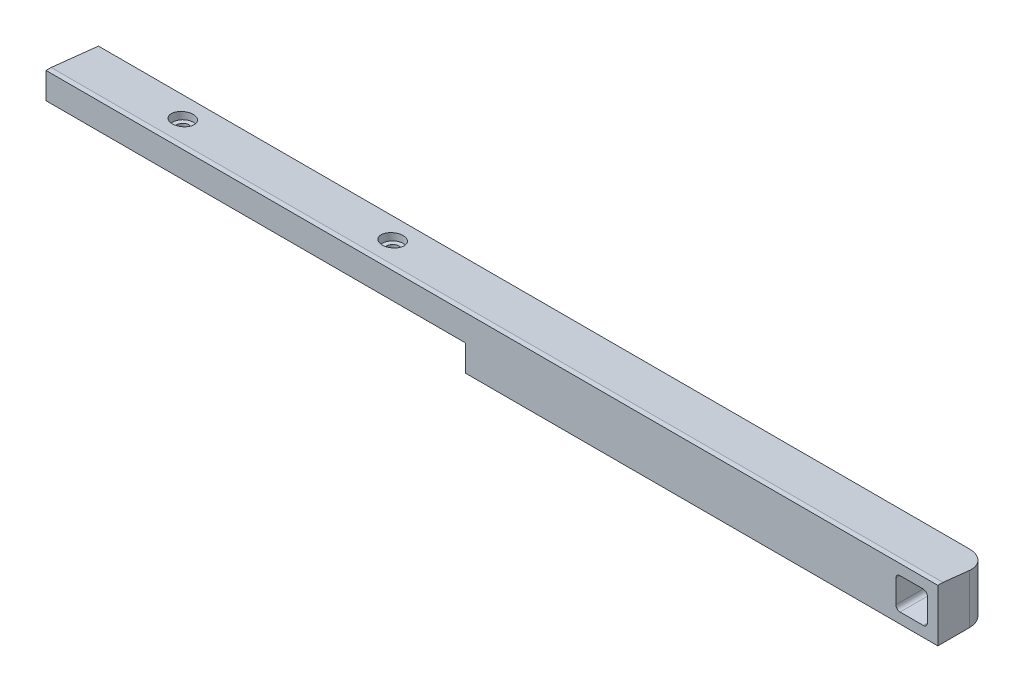
ISO-10303-21;
HEADER;
FILE_DESCRIPTION(('STEP AP214'),'2;1');
FILE_NAME('part.step','',(''),(''),'','','');
FILE_SCHEMA(('AUTOMOTIVE_DESIGN { 1 0 10303 214 1 1 1 1 }'));
ENDSEC;
DATA;
#1=APPLICATION_CONTEXT('core data for automotive mechanical design processes');
#2=APPLICATION_PROTOCOL_DEFINITION('international standard','automotive_design',2000,#1);
#3=PRODUCT_CONTEXT('',#1,'mechanical');
#4=PRODUCT('Part','Part','',(#3));
#5=PRODUCT_RELATED_PRODUCT_CATEGORY('part','',(#4));
#6=PRODUCT_DEFINITION_FORMATION('','',#4);
#7=PRODUCT_DEFINITION_CONTEXT('part definition',#1,'design');
#8=PRODUCT_DEFINITION('design','',#6,#7);
#9=PRODUCT_DEFINITION_SHAPE('','',#8);
#10=(LENGTH_UNIT() NAMED_UNIT(*) SI_UNIT(.MILLI.,.METRE.));
#11=(NAMED_UNIT(*) PLANE_ANGLE_UNIT() SI_UNIT($,.RADIAN.));
#12=(NAMED_UNIT(*) SI_UNIT($,.STERADIAN.) SOLID_ANGLE_UNIT());
#13=UNCERTAINTY_MEASURE_WITH_UNIT(LENGTH_MEASURE(1.E-05),#10,'distance_accuracy_value','');
#14=(GEOMETRIC_REPRESENTATION_CONTEXT(3) GLOBAL_UNCERTAINTY_ASSIGNED_CONTEXT((#13)) GLOBAL_UNIT_ASSIGNED_CONTEXT((#10,
#11,#12)) REPRESENTATION_CONTEXT('',''));
#15=CARTESIAN_POINT('',(0.,0.,0.));
#16=DIRECTION('',(0.,0.,1.));
#17=DIRECTION('',(1.,0.,0.));
#18=AXIS2_PLACEMENT_3D('',#15,#16,#17);
#19=CARTESIAN_POINT('',(135.886266753297,-328.191488077078,-130.629585564262));
#20=DIRECTION('',(0.,1.,0.));
#21=DIRECTION('',(0.,0.,1.));
#22=AXIS2_PLACEMENT_3D('',#19,#20,#21);
#23=CYLINDRICAL_SURFACE('',#22,1.75000000000001);
#24=CARTESIAN_POINT('',(135.886266753297,92.5,-130.629585564262));
#25=DIRECTION('',(0.,-1.,0.));
#26=DIRECTION('',(0.,0.,-1.));
#27=AXIS2_PLACEMENT_3D('',#24,#25,#26);
#28=CIRCLE('',#27,1.75000000000001);
#29=CARTESIAN_POINT('',(135.886266753297,92.5,-132.379585564262));
#30=VERTEX_POINT('',#29);
#31=EDGE_CURVE('E227',#30,#30,#28,.T.);
#32=ORIENTED_EDGE('',*,*,#31,.T.);
#33=EDGE_LOOP('',(#32));
#34=FACE_BOUND('',#33,.T.);
#35=CARTESIAN_POINT('',(135.886266753297,97.,-130.629585564262));
#36=DIRECTION('',(0.,1.,0.));
#37=DIRECTION('',(0.,0.,1.));
#38=AXIS2_PLACEMENT_3D('',#35,#36,#37);
#39=CIRCLE('',#38,1.75000000000001);
#40=CARTESIAN_POINT('',(135.886266753297,97.,-128.879585564262));
#41=VERTEX_POINT('',#40);
#42=EDGE_CURVE('E257',#41,#41,#39,.F.);
#43=ORIENTED_EDGE('',*,*,#42,.F.);
#44=EDGE_LOOP('',(#43));
#45=FACE_BOUND('',#44,.T.);
#46=ADVANCED_FACE('F39',(#34,#45),#23,.F.);
#47=CARTESIAN_POINT('',(195.886266753297,-328.191488077078,-130.629585564262));
#48=DIRECTION('',(0.,1.,0.));
#49=DIRECTION('',(0.,0.,1.));
#50=AXIS2_PLACEMENT_3D('',#47,#48,#49);
#51=CYLINDRICAL_SURFACE('',#50,1.75000000000001);
#52=CARTESIAN_POINT('',(195.886266753297,92.5,-130.629585564262));
#53=DIRECTION('',(0.,-1.,0.));
#54=DIRECTION('',(0.,0.,-1.));
#55=AXIS2_PLACEMENT_3D('',#52,#53,#54);
#56=CIRCLE('',#55,1.75000000000001);
#57=CARTESIAN_POINT('',(195.886266753297,92.5,-132.379585564262));
#58=VERTEX_POINT('',#57);
#59=EDGE_CURVE('E269',#58,#58,#56,.T.);
#60=ORIENTED_EDGE('',*,*,#59,.T.);
#61=EDGE_LOOP('',(#60));
#62=FACE_BOUND('',#61,.T.);
#63=CARTESIAN_POINT('',(195.886266753297,97.,-130.629585564262));
#64=DIRECTION('',(0.,1.,0.));
#65=DIRECTION('',(0.,0.,1.));
#66=AXIS2_PLACEMENT_3D('',#63,#64,#65);
#67=CIRCLE('',#66,1.75000000000001);
#68=CARTESIAN_POINT('',(195.886266753297,97.,-128.879585564262));
#69=VERTEX_POINT('',#68);
#70=EDGE_CURVE('E253',#69,#69,#67,.F.);
#71=ORIENTED_EDGE('',*,*,#70,.F.);
#72=EDGE_LOOP('',(#71));
#73=FACE_BOUND('',#72,.T.);
#74=ADVANCED_FACE('F354',(#62,#73),#51,.F.);
#75=CARTESIAN_POINT('',(225.,92.5,-137.41));
#76=DIRECTION('',(-1.,0.,0.));
#77=DIRECTION('',(0.,0.,1.));
#78=AXIS2_PLACEMENT_3D('',#75,#76,#77);
#79=PLANE('',#78);
#80=DIRECTION('',(0.,1.,0.));
#81=VECTOR('',#80,1.);
#82=CARTESIAN_POINT('',(225.,100.,-137.4));
#83=LINE('',#82,#81);
#84=CARTESIAN_POINT('',(225.,85.,-137.4));
#85=VERTEX_POINT('',#84);
#86=CARTESIAN_POINT('',(225.,92.5,-137.4));
#87=VERTEX_POINT('',#86);
#88=EDGE_CURVE('E207',#85,#87,#83,.T.);
#89=ORIENTED_EDGE('',*,*,#88,.F.);
#90=DIRECTION('',(0.,0.,-1.));
#91=VECTOR('',#90,1.);
#92=CARTESIAN_POINT('',(225.,85.,-122.4));
#93=LINE('',#92,#91);
#94=CARTESIAN_POINT('',(225.,85.,-122.4));
#95=VERTEX_POINT('',#94);
#96=EDGE_CURVE('E203',#95,#85,#93,.T.);
#97=ORIENTED_EDGE('',*,*,#96,.F.);
#98=DIRECTION('',(0.,-1.,0.));
#99=VECTOR('',#98,1.);
#100=CARTESIAN_POINT('',(225.,100.,-122.4));
#101=LINE('',#100,#99);
#102=CARTESIAN_POINT('',(225.,92.5,-122.4));
#103=VERTEX_POINT('',#102);
#104=EDGE_CURVE('E190',#103,#95,#101,.T.);
#105=ORIENTED_EDGE('',*,*,#104,.F.);
#106=DIRECTION('',(0.,0.,1.));
#107=VECTOR('',#106,1.);
#108=CARTESIAN_POINT('',(225.,92.5,-137.41));
#109=LINE('',#108,#107);
#110=EDGE_CURVE('E11',#87,#103,#109,.T.);
#111=ORIENTED_EDGE('',*,*,#110,.F.);
#112=EDGE_LOOP('',(#89,#97,#105,#111));
#113=FACE_BOUND('',#112,.T.);
#114=ADVANCED_FACE('F360',(#113),#79,.T.);
#115=CARTESIAN_POINT('',(105.,100.,-137.41));
#116=DIRECTION('',(-1.,0.,0.));
#117=DIRECTION('',(0.,0.,1.));
#118=AXIS2_PLACEMENT_3D('',#115,#116,#117);
#119=PLANE('',#118);
#120=DIRECTION('',(0.,-1.,0.));
#121=VECTOR('',#120,1.);
#122=CARTESIAN_POINT('',(105.,100.,-122.4));
#123=LINE('',#122,#121);
#124=CARTESIAN_POINT('',(105.,100.,-122.4));
#125=VERTEX_POINT('',#124);
#126=CARTESIAN_POINT('',(105.,92.5,-122.4));
#127=VERTEX_POINT('',#126);
#128=EDGE_CURVE('E199',#125,#127,#123,.T.);
#129=ORIENTED_EDGE('',*,*,#128,.F.);
#130=DIRECTION('',(0.,0.,1.));
#131=VECTOR('',#130,1.);
#132=CARTESIAN_POINT('',(105.,100.,-122.4));
#133=LINE('',#132,#131);
#134=CARTESIAN_POINT('',(105.,100.,-123.859171128524));
#135=VERTEX_POINT('',#134);
#136=EDGE_CURVE('E219',#135,#125,#133,.T.);
#137=ORIENTED_EDGE('',*,*,#136,.F.);
#138=DIRECTION('',(0.,-0.107870042588919,-0.994165003363056));
#139=VECTOR('',#138,1.);
#140=CARTESIAN_POINT('',(105.,113.764620707969,3.));
#141=LINE('',#140,#139);
#142=CARTESIAN_POINT('',(105.,98.5307773034513,-137.4));
#143=VERTEX_POINT('',#142);
#144=EDGE_CURVE('E223',#135,#143,#141,.T.);
#145=ORIENTED_EDGE('',*,*,#144,.T.);
#146=DIRECTION('',(0.,1.,0.));
#147=VECTOR('',#146,1.);
#148=CARTESIAN_POINT('',(105.,100.,-137.4));
#149=LINE('',#148,#147);
#150=CARTESIAN_POINT('',(105.,92.5,-137.4));
#151=VERTEX_POINT('',#150);
#152=EDGE_CURVE('E215',#151,#143,#149,.T.);
#153=ORIENTED_EDGE('',*,*,#152,.F.);
#154=DIRECTION('',(0.,0.,1.));
#155=VECTOR('',#154,1.);
#156=CARTESIAN_POINT('',(105.,92.5,-137.41));
#157=LINE('',#156,#155);
#158=EDGE_CURVE('E50',#151,#127,#157,.T.);
#159=ORIENTED_EDGE('',*,*,#158,.T.);
#160=EDGE_LOOP('',(#129,#137,#145,#153,#159));
#161=FACE_BOUND('',#160,.T.);
#162=ADVANCED_FACE('F408',(#161),#119,.T.);
#163=CARTESIAN_POINT('',(105.,92.5,-137.41));
#164=DIRECTION('',(0.,-1.,0.));
#165=DIRECTION('',(0.,0.,-1.));
#166=AXIS2_PLACEMENT_3D('',#163,#164,#165);
#167=PLANE('',#166);
#168=ORIENTED_EDGE('',*,*,#59,.F.);
#169=EDGE_LOOP('',(#168));
#170=FACE_BOUND('',#169,.T.);
#171=ORIENTED_EDGE('',*,*,#31,.F.);
#172=EDGE_LOOP('',(#171));
#173=FACE_BOUND('',#172,.T.);
#174=DIRECTION('',(-1.,0.,0.));
#175=VECTOR('',#174,1.);
#176=CARTESIAN_POINT('',(381.213203435596,92.5,-137.4));
#177=LINE('',#176,#175);
#178=EDGE_CURVE('E211',#87,#151,#177,.T.);
#179=ORIENTED_EDGE('',*,*,#178,.F.);
#180=ORIENTED_EDGE('',*,*,#110,.T.);
#181=DIRECTION('',(1.,0.,0.));
#182=VECTOR('',#181,1.);
#183=CARTESIAN_POINT('',(381.213203435596,92.5,-122.4));
#184=LINE('',#183,#182);
#185=EDGE_CURVE('E195',#127,#103,#184,.T.);
#186=ORIENTED_EDGE('',*,*,#185,.F.);
#187=ORIENTED_EDGE('',*,*,#158,.F.);
#188=EDGE_LOOP('',(#179,#180,#186,#187));
#189=FACE_BOUND('',#188,.T.);
#190=ADVANCED_FACE('F506',(#170,#173,#189),#167,.T.);
#191=CARTESIAN_POINT('',(381.213203435596,100.,-122.4));
#192=DIRECTION('',(0.,1.,0.));
#193=DIRECTION('',(0.,0.,1.));
#194=AXIS2_PLACEMENT_3D('',#191,#192,#193);
#195=PLANE('',#194);
#196=DIRECTION('',(1.,0.,0.));
#197=VECTOR('',#196,1.);
#198=CARTESIAN_POINT('',(381.213203435596,100.,-123.859171128524));
#199=LINE('',#198,#197);
#200=CARTESIAN_POINT('',(360.,100.,-123.859171128524));
#201=VERTEX_POINT('',#200);
#202=EDGE_CURVE('E244',#135,#201,#199,.T.);
#203=ORIENTED_EDGE('',*,*,#202,.F.);
#204=ORIENTED_EDGE('',*,*,#136,.T.);
#205=DIRECTION('',(-1.,0.,0.));
#206=VECTOR('',#205,1.);
#207=CARTESIAN_POINT('',(381.213203435596,100.,-122.4));
#208=LINE('',#207,#206);
#209=CARTESIAN_POINT('',(360.,100.,-122.4));
#210=VERTEX_POINT('',#209);
#211=EDGE_CURVE('E228',#210,#125,#208,.T.);
#212=ORIENTED_EDGE('',*,*,#211,.F.);
#213=DIRECTION('',(0.,0.,-1.));
#214=VECTOR('',#213,1.);
#215=CARTESIAN_POINT('',(360.,100.,-122.4));
#216=LINE('',#215,#214);
#217=EDGE_CURVE('E243',#210,#201,#216,.T.);
#218=ORIENTED_EDGE('',*,*,#217,.T.);
#219=EDGE_LOOP('',(#203,#204,#212,#218));
#220=FACE_BOUND('',#219,.T.);
#221=ADVANCED_FACE('F362',(#220),#195,.T.);
#222=CARTESIAN_POINT('',(381.213203435596,100.,-137.4));
#223=DIRECTION('',(0.,0.,-1.));
#224=DIRECTION('',(-1.,0.,0.));
#225=AXIS2_PLACEMENT_3D('',#222,#223,#224);
#226=PLANE('',#225);
#227=ORIENTED_EDGE('',*,*,#178,.T.);
#228=ORIENTED_EDGE('',*,*,#152,.T.);
#229=DIRECTION('',(1.,0.,0.));
#230=VECTOR('',#229,1.);
#231=CARTESIAN_POINT('',(-32.0005,98.5307773034513,-137.4));
#232=LINE('',#231,#230);
#233=CARTESIAN_POINT('',(354.,98.5307773034513,-137.4));
#234=VERTEX_POINT('',#233);
#235=EDGE_CURVE('E249',#143,#234,#232,.T.);
#236=ORIENTED_EDGE('',*,*,#235,.T.);
#237=DIRECTION('',(0.,-1.,0.));
#238=VECTOR('',#237,1.);
#239=CARTESIAN_POINT('',(354.,100.,-137.4));
#240=LINE('',#239,#238);
#241=CARTESIAN_POINT('',(354.,85.,-137.4));
#242=VERTEX_POINT('',#241);
#243=EDGE_CURVE('E293',#234,#242,#240,.T.);
#244=ORIENTED_EDGE('',*,*,#243,.T.);
#245=DIRECTION('',(-1.,0.,0.));
#246=VECTOR('',#245,1.);
#247=CARTESIAN_POINT('',(381.213203435596,85.,-137.4));
#248=LINE('',#247,#246);
#249=EDGE_CURVE('E239',#242,#85,#248,.T.);
#250=ORIENTED_EDGE('',*,*,#249,.T.);
#251=ORIENTED_EDGE('',*,*,#88,.T.);
#252=EDGE_LOOP('',(#227,#228,#236,#244,#250,#251));
#253=FACE_BOUND('',#252,.T.);
#254=ADVANCED_FACE('F485',(#253),#226,.T.);
#255=CARTESIAN_POINT('',(381.213203435596,85.,-122.4));
#256=DIRECTION('',(0.,-1.,0.));
#257=DIRECTION('',(0.,0.,-1.));
#258=AXIS2_PLACEMENT_3D('',#255,#256,#257);
#259=PLANE('',#258);
#260=DIRECTION('',(-1.,0.,0.));
#261=VECTOR('',#260,1.);
#262=CARTESIAN_POINT('',(381.213203435596,85.,-122.4));
#263=LINE('',#262,#261);
#264=CARTESIAN_POINT('',(360.,85.,-122.4));
#265=VERTEX_POINT('',#264);
#266=EDGE_CURVE('E234',#265,#95,#263,.T.);
#267=ORIENTED_EDGE('',*,*,#266,.T.);
#268=ORIENTED_EDGE('',*,*,#96,.T.);
#269=ORIENTED_EDGE('',*,*,#249,.F.);
#270=CARTESIAN_POINT('',(354.,85.,-131.4));
#271=DIRECTION('',(0.,-1.,0.));
#272=DIRECTION('',(0.,0.,-1.));
#273=AXIS2_PLACEMENT_3D('',#270,#271,#272);
#274=CIRCLE('',#273,6.);
#275=CARTESIAN_POINT('',(360.,85.,-131.4));
#276=VERTEX_POINT('',#275);
#277=EDGE_CURVE('E233',#242,#276,#274,.T.);
#278=ORIENTED_EDGE('',*,*,#277,.T.);
#279=DIRECTION('',(0.,0.,1.));
#280=VECTOR('',#279,1.);
#281=CARTESIAN_POINT('',(360.,85.,-122.4));
#282=LINE('',#281,#280);
#283=EDGE_CURVE('E238',#276,#265,#282,.T.);
#284=ORIENTED_EDGE('',*,*,#283,.T.);
#285=EDGE_LOOP('',(#267,#268,#269,#278,#284));
#286=FACE_BOUND('',#285,.T.);
#287=ADVANCED_FACE('F476',(#286),#259,.T.);
#288=CARTESIAN_POINT('',(381.213203435596,100.,-122.4));
#289=DIRECTION('',(0.,0.,1.));
#290=DIRECTION('',(0.,-1.,0.));
#291=AXIS2_PLACEMENT_3D('',#288,#289,#290);
#292=PLANE('',#291);
#293=CARTESIAN_POINT('',(355.8,89.1999999999999,-122.4));
#294=DIRECTION('',(0.,0.,1.));
#295=DIRECTION('',(1.,0.,0.));
#296=AXIS2_PLACEMENT_3D('',#293,#294,#295);
#297=CIRCLE('',#296,1.19999999999999);
#298=CARTESIAN_POINT('',(355.8,87.9999999999999,-122.4));
#299=VERTEX_POINT('',#298);
#300=CARTESIAN_POINT('',(357.,89.1999999999999,-122.4));
#301=VERTEX_POINT('',#300);
#302=EDGE_CURVE('E154',#299,#301,#297,.T.);
#303=ORIENTED_EDGE('',*,*,#302,.F.);
#304=DIRECTION('',(1.,0.,0.));
#305=VECTOR('',#304,1.);
#306=CARTESIAN_POINT('',(349.2,87.9999999999999,-122.4));
#307=LINE('',#306,#305);
#308=CARTESIAN_POINT('',(349.2,87.9999999999999,-122.4));
#309=VERTEX_POINT('',#308);
#310=EDGE_CURVE('E185',#309,#299,#307,.T.);
#311=ORIENTED_EDGE('',*,*,#310,.F.);
#312=CARTESIAN_POINT('',(349.2,89.1999999999999,-122.4));
#313=DIRECTION('',(0.,0.,1.));
#314=DIRECTION('',(1.,0.,0.));
#315=AXIS2_PLACEMENT_3D('',#312,#313,#314);
#316=CIRCLE('',#315,1.19999999999999);
#317=CARTESIAN_POINT('',(348.,89.1999999999999,-122.4));
#318=VERTEX_POINT('',#317);
#319=EDGE_CURVE('E145',#318,#309,#316,.T.);
#320=ORIENTED_EDGE('',*,*,#319,.F.);
#321=DIRECTION('',(0.,-1.,0.));
#322=VECTOR('',#321,1.);
#323=CARTESIAN_POINT('',(348.,95.7999999999999,-122.4));
#324=LINE('',#323,#322);
#325=CARTESIAN_POINT('',(348.,95.7999999999999,-122.4));
#326=VERTEX_POINT('',#325);
#327=EDGE_CURVE('E140',#326,#318,#324,.T.);
#328=ORIENTED_EDGE('',*,*,#327,.F.);
#329=CARTESIAN_POINT('',(349.2,95.7999999999999,-122.4));
#330=DIRECTION('',(0.,0.,1.));
#331=DIRECTION('',(1.,0.,0.));
#332=AXIS2_PLACEMENT_3D('',#329,#330,#331);
#333=CIRCLE('',#332,1.19999999999999);
#334=CARTESIAN_POINT('',(349.2,96.9999999999999,-122.4));
#335=VERTEX_POINT('',#334);
#336=EDGE_CURVE('E117',#335,#326,#333,.T.);
#337=ORIENTED_EDGE('',*,*,#336,.F.);
#338=DIRECTION('',(-1.,0.,0.));
#339=VECTOR('',#338,1.);
#340=CARTESIAN_POINT('',(355.8,96.9999999999999,-122.4));
#341=LINE('',#340,#339);
#342=CARTESIAN_POINT('',(355.8,96.9999999999999,-122.4));
#343=VERTEX_POINT('',#342);
#344=EDGE_CURVE('E129',#343,#335,#341,.T.);
#345=ORIENTED_EDGE('',*,*,#344,.F.);
#346=CARTESIAN_POINT('',(355.8,95.7999999999999,-122.4));
#347=DIRECTION('',(0.,0.,1.));
#348=DIRECTION('',(1.,0.,0.));
#349=AXIS2_PLACEMENT_3D('',#346,#347,#348);
#350=CIRCLE('',#349,1.19999999999999);
#351=CARTESIAN_POINT('',(357.,95.7999999999999,-122.4));
#352=VERTEX_POINT('',#351);
#353=EDGE_CURVE('E134',#352,#343,#350,.T.);
#354=ORIENTED_EDGE('',*,*,#353,.F.);
#355=DIRECTION('',(0.,1.,0.));
#356=VECTOR('',#355,1.);
#357=CARTESIAN_POINT('',(357.,89.1999999999999,-122.4));
#358=LINE('',#357,#356);
#359=EDGE_CURVE('E151',#301,#352,#358,.T.);
#360=ORIENTED_EDGE('',*,*,#359,.F.);
#361=EDGE_LOOP('',(#303,#311,#320,#328,#337,#345,#354,#360));
#362=FACE_BOUND('',#361,.T.);
#363=ORIENTED_EDGE('',*,*,#211,.T.);
#364=ORIENTED_EDGE('',*,*,#128,.T.);
#365=ORIENTED_EDGE('',*,*,#185,.T.);
#366=ORIENTED_EDGE('',*,*,#104,.T.);
#367=ORIENTED_EDGE('',*,*,#266,.F.);
#368=DIRECTION('',(0.,1.,0.));
#369=VECTOR('',#368,1.);
#370=CARTESIAN_POINT('',(360.,100.,-122.4));
#371=LINE('',#370,#369);
#372=EDGE_CURVE('E232',#265,#210,#371,.T.);
#373=ORIENTED_EDGE('',*,*,#372,.T.);
#374=EDGE_LOOP('',(#363,#364,#365,#366,#367,#373));
#375=FACE_BOUND('',#374,.T.);
#376=ADVANCED_FACE('F41',(#362,#375),#292,.T.);
#377=CARTESIAN_POINT('',(-32.0005,113.764620707969,3.));
#378=DIRECTION('',(0.,-0.994165003363056,0.107870042588919));
#379=DIRECTION('',(0.,-0.107870042588919,-0.994165003363056));
#380=AXIS2_PLACEMENT_3D('',#377,#378,#379);
#381=PLANE('',#380);
#382=CARTESIAN_POINT('',(135.886266753297,99.2653886517257,-130.629585564262));
#383=DIRECTION('',(0.,-0.994165003363056,0.107870042588919));
#384=DIRECTION('',(0.,0.107870042588919,0.994165003363056));
#385=AXIS2_PLACEMENT_3D('',#382,#383,#384);
#386=ELLIPSE('',#385,3.01760773096177,2.99999999999999);
#387=CARTESIAN_POINT('',(135.886266753297,99.5908981261812,-127.629585564262));
#388=VERTEX_POINT('',#387);
#389=EDGE_CURVE('E43',#388,#388,#386,.T.);
#390=ORIENTED_EDGE('',*,*,#389,.T.);
#391=EDGE_LOOP('',(#390));
#392=FACE_BOUND('',#391,.T.);
#393=CARTESIAN_POINT('',(195.886266753297,99.2653886517257,-130.629585564262));
#394=DIRECTION('',(0.,-0.994165003363056,0.107870042588919));
#395=DIRECTION('',(0.,0.107870042588919,0.994165003363056));
#396=AXIS2_PLACEMENT_3D('',#393,#394,#395);
#397=ELLIPSE('',#396,3.01760773096177,2.99999999999999);
#398=CARTESIAN_POINT('',(195.886266753297,99.5908981261812,-127.629585564262));
#399=VERTEX_POINT('',#398);
#400=EDGE_CURVE('E261',#399,#399,#397,.T.);
#401=ORIENTED_EDGE('',*,*,#400,.T.);
#402=EDGE_LOOP('',(#401));
#403=FACE_BOUND('',#402,.T.);
#404=ORIENTED_EDGE('',*,*,#144,.F.);
#405=ORIENTED_EDGE('',*,*,#202,.T.);
#406=DIRECTION('',(0.,-0.107870042588919,-0.994165003363056));
#407=VECTOR('',#406,1.);
#408=CARTESIAN_POINT('',(360.,96.0984167930142,-159.817416708124));
#409=LINE('',#408,#407);
#410=CARTESIAN_POINT('',(360.,99.1817962523623,-131.4));
#411=VERTEX_POINT('',#410);
#412=EDGE_CURVE('E248',#201,#411,#409,.T.);
#413=ORIENTED_EDGE('',*,*,#412,.T.);
#414=CARTESIAN_POINT('',(354.,99.1817962523623,-131.4));
#415=DIRECTION('',(0.,-0.994165003363056,0.107870042588919));
#416=DIRECTION('',(0.,-0.107870042588919,-0.994165003363056));
#417=AXIS2_PLACEMENT_3D('',#414,#415,#416);
#418=ELLIPSE('',#417,6.03521546192356,6.);
#419=EDGE_CURVE('E194',#411,#234,#418,.F.);
#420=ORIENTED_EDGE('',*,*,#419,.T.);
#421=ORIENTED_EDGE('',*,*,#235,.F.);
#422=EDGE_LOOP('',(#404,#405,#413,#420,#421));
#423=FACE_BOUND('',#422,.T.);
#424=ADVANCED_FACE('F374',(#392,#403,#423),#381,.F.);
#425=CARTESIAN_POINT('',(360.,85.,-158.613203435596));
#426=DIRECTION('',(1.,0.,0.));
#427=DIRECTION('',(0.,0.,-1.));
#428=AXIS2_PLACEMENT_3D('',#425,#426,#427);
#429=PLANE('',#428);
#430=ORIENTED_EDGE('',*,*,#412,.F.);
#431=ORIENTED_EDGE('',*,*,#217,.F.);
#432=ORIENTED_EDGE('',*,*,#372,.F.);
#433=ORIENTED_EDGE('',*,*,#283,.F.);
#434=DIRECTION('',(0.,-1.,0.));
#435=VECTOR('',#434,1.);
#436=CARTESIAN_POINT('',(360.,85.,-131.4));
#437=LINE('',#436,#435);
#438=EDGE_CURVE('E289',#276,#411,#437,.F.);
#439=ORIENTED_EDGE('',*,*,#438,.T.);
#440=EDGE_LOOP('',(#430,#431,#432,#433,#439));
#441=FACE_BOUND('',#440,.T.);
#442=ADVANCED_FACE('F370',(#441),#429,.T.);
#443=CARTESIAN_POINT('',(354.,100.,-131.4));
#444=DIRECTION('',(0.,-1.,0.));
#445=DIRECTION('',(0.,0.,-1.));
#446=AXIS2_PLACEMENT_3D('',#443,#444,#445);
#447=CYLINDRICAL_SURFACE('',#446,6.);
#448=ORIENTED_EDGE('',*,*,#419,.F.);
#449=ORIENTED_EDGE('',*,*,#438,.F.);
#450=ORIENTED_EDGE('',*,*,#277,.F.);
#451=ORIENTED_EDGE('',*,*,#243,.F.);
#452=EDGE_LOOP('',(#448,#449,#450,#451));
#453=FACE_BOUND('',#452,.T.);
#454=ADVANCED_FACE('F366',(#453),#447,.T.);
#455=CARTESIAN_POINT('',(355.8,89.1999999999999,-132.4));
#456=DIRECTION('',(0.,0.,1.));
#457=DIRECTION('',(1.,0.,0.));
#458=AXIS2_PLACEMENT_3D('',#455,#456,#457);
#459=CYLINDRICAL_SURFACE('',#458,1.19999999999999);
#460=ORIENTED_EDGE('',*,*,#302,.T.);
#461=DIRECTION('',(0.,0.,1.));
#462=VECTOR('',#461,1.);
#463=CARTESIAN_POINT('',(357.,89.1999999999999,-132.4));
#464=LINE('',#463,#462);
#465=CARTESIAN_POINT('',(357.,89.1999999999999,-132.4));
#466=VERTEX_POINT('',#465);
#467=EDGE_CURVE('E93',#466,#301,#464,.T.);
#468=ORIENTED_EDGE('',*,*,#467,.F.);
#469=CARTESIAN_POINT('',(355.8,89.1999999999999,-132.4));
#470=DIRECTION('',(0.,0.,1.));
#471=DIRECTION('',(1.,0.,0.));
#472=AXIS2_PLACEMENT_3D('',#469,#470,#471);
#473=CIRCLE('',#472,1.19999999999999);
#474=CARTESIAN_POINT('',(355.8,87.9999999999999,-132.4));
#475=VERTEX_POINT('',#474);
#476=EDGE_CURVE('E182',#475,#466,#473,.T.);
#477=ORIENTED_EDGE('',*,*,#476,.F.);
#478=DIRECTION('',(0.,0.,1.));
#479=VECTOR('',#478,1.);
#480=CARTESIAN_POINT('',(355.8,87.9999999999999,-132.4));
#481=LINE('',#480,#479);
#482=EDGE_CURVE('E97',#475,#299,#481,.T.);
#483=ORIENTED_EDGE('',*,*,#482,.T.);
#484=EDGE_LOOP('',(#460,#468,#477,#483));
#485=FACE_BOUND('',#484,.T.);
#486=ADVANCED_FACE('F369',(#485),#459,.F.);
#487=CARTESIAN_POINT('',(349.2,87.9999999999999,-132.4));
#488=DIRECTION('',(0.,-1.,0.));
#489=DIRECTION('',(0.,0.,-1.));
#490=AXIS2_PLACEMENT_3D('',#487,#488,#489);
#491=PLANE('',#490);
#492=ORIENTED_EDGE('',*,*,#310,.T.);
#493=ORIENTED_EDGE('',*,*,#482,.F.);
#494=DIRECTION('',(1.,0.,0.));
#495=VECTOR('',#494,1.);
#496=CARTESIAN_POINT('',(349.2,87.9999999999999,-132.4));
#497=LINE('',#496,#495);
#498=CARTESIAN_POINT('',(349.2,87.9999999999999,-132.4));
#499=VERTEX_POINT('',#498);
#500=EDGE_CURVE('E157',#499,#475,#497,.T.);
#501=ORIENTED_EDGE('',*,*,#500,.F.);
#502=DIRECTION('',(0.,0.,1.));
#503=VECTOR('',#502,1.);
#504=CARTESIAN_POINT('',(349.2,87.9999999999999,-132.4));
#505=LINE('',#504,#503);
#506=EDGE_CURVE('E323',#499,#309,#505,.T.);
#507=ORIENTED_EDGE('',*,*,#506,.T.);
#508=EDGE_LOOP('',(#492,#493,#501,#507));
#509=FACE_BOUND('',#508,.T.);
#510=ADVANCED_FACE('F338',(#509),#491,.F.);
#511=CARTESIAN_POINT('',(349.2,89.1999999999999,-132.4));
#512=DIRECTION('',(0.,0.,1.));
#513=DIRECTION('',(1.,0.,0.));
#514=AXIS2_PLACEMENT_3D('',#511,#512,#513);
#515=CYLINDRICAL_SURFACE('',#514,1.19999999999999);
#516=ORIENTED_EDGE('',*,*,#319,.T.);
#517=ORIENTED_EDGE('',*,*,#506,.F.);
#518=CARTESIAN_POINT('',(349.2,89.1999999999999,-132.4));
#519=DIRECTION('',(0.,0.,1.));
#520=DIRECTION('',(1.,0.,0.));
#521=AXIS2_PLACEMENT_3D('',#518,#519,#520);
#522=CIRCLE('',#521,1.19999999999999);
#523=CARTESIAN_POINT('',(348.,89.1999999999999,-132.4));
#524=VERTEX_POINT('',#523);
#525=EDGE_CURVE('E161',#524,#499,#522,.T.);
#526=ORIENTED_EDGE('',*,*,#525,.F.);
#527=DIRECTION('',(0.,0.,1.));
#528=VECTOR('',#527,1.);
#529=CARTESIAN_POINT('',(348.,89.1999999999999,-132.4));
#530=LINE('',#529,#528);
#531=EDGE_CURVE('E320',#524,#318,#530,.T.);
#532=ORIENTED_EDGE('',*,*,#531,.T.);
#533=EDGE_LOOP('',(#516,#517,#526,#532));
#534=FACE_BOUND('',#533,.T.);
#535=ADVANCED_FACE('F334',(#534),#515,.F.);
#536=CARTESIAN_POINT('',(348.,95.7999999999999,-132.4));
#537=DIRECTION('',(-1.,0.,0.));
#538=DIRECTION('',(0.,0.,1.));
#539=AXIS2_PLACEMENT_3D('',#536,#537,#538);
#540=PLANE('',#539);
#541=ORIENTED_EDGE('',*,*,#327,.T.);
#542=ORIENTED_EDGE('',*,*,#531,.F.);
#543=DIRECTION('',(0.,-1.,0.));
#544=VECTOR('',#543,1.);
#545=CARTESIAN_POINT('',(348.,95.7999999999999,-132.4));
#546=LINE('',#545,#544);
#547=CARTESIAN_POINT('',(348.,95.7999999999999,-132.4));
#548=VERTEX_POINT('',#547);
#549=EDGE_CURVE('E165',#548,#524,#546,.T.);
#550=ORIENTED_EDGE('',*,*,#549,.F.);
#551=DIRECTION('',(0.,0.,1.));
#552=VECTOR('',#551,1.);
#553=CARTESIAN_POINT('',(348.,95.7999999999999,-132.4));
#554=LINE('',#553,#552);
#555=EDGE_CURVE('E126',#548,#326,#554,.T.);
#556=ORIENTED_EDGE('',*,*,#555,.T.);
#557=EDGE_LOOP('',(#541,#542,#550,#556));
#558=FACE_BOUND('',#557,.T.);
#559=ADVANCED_FACE('F344',(#558),#540,.F.);
#560=CARTESIAN_POINT('',(349.2,95.7999999999999,-132.4));
#561=DIRECTION('',(0.,0.,1.));
#562=DIRECTION('',(1.,0.,0.));
#563=AXIS2_PLACEMENT_3D('',#560,#561,#562);
#564=CYLINDRICAL_SURFACE('',#563,1.19999999999999);
#565=ORIENTED_EDGE('',*,*,#336,.T.);
#566=ORIENTED_EDGE('',*,*,#555,.F.);
#567=CARTESIAN_POINT('',(349.2,95.7999999999999,-132.4));
#568=DIRECTION('',(0.,0.,1.));
#569=DIRECTION('',(1.,0.,0.));
#570=AXIS2_PLACEMENT_3D('',#567,#568,#569);
#571=CIRCLE('',#570,1.19999999999999);
#572=CARTESIAN_POINT('',(349.2,96.9999999999999,-132.4));
#573=VERTEX_POINT('',#572);
#574=EDGE_CURVE('E120',#573,#548,#571,.T.);
#575=ORIENTED_EDGE('',*,*,#574,.F.);
#576=DIRECTION('',(0.,0.,1.));
#577=VECTOR('',#576,1.);
#578=CARTESIAN_POINT('',(349.2,96.9999999999999,-132.4));
#579=LINE('',#578,#577);
#580=EDGE_CURVE('E113',#573,#335,#579,.T.);
#581=ORIENTED_EDGE('',*,*,#580,.T.);
#582=EDGE_LOOP('',(#565,#566,#575,#581));
#583=FACE_BOUND('',#582,.T.);
#584=ADVANCED_FACE('F115',(#583),#564,.F.);
#585=CARTESIAN_POINT('',(355.8,96.9999999999999,-132.4));
#586=DIRECTION('',(0.,1.,0.));
#587=DIRECTION('',(0.,0.,1.));
#588=AXIS2_PLACEMENT_3D('',#585,#586,#587);
#589=PLANE('',#588);
#590=ORIENTED_EDGE('',*,*,#344,.T.);
#591=ORIENTED_EDGE('',*,*,#580,.F.);
#592=DIRECTION('',(-1.,0.,0.));
#593=VECTOR('',#592,1.);
#594=CARTESIAN_POINT('',(355.8,96.9999999999999,-132.4));
#595=LINE('',#594,#593);
#596=CARTESIAN_POINT('',(355.8,96.9999999999999,-132.4));
#597=VERTEX_POINT('',#596);
#598=EDGE_CURVE('E171',#597,#573,#595,.T.);
#599=ORIENTED_EDGE('',*,*,#598,.F.);
#600=DIRECTION('',(0.,0.,1.));
#601=VECTOR('',#600,1.);
#602=CARTESIAN_POINT('',(355.8,96.9999999999999,-132.4));
#603=LINE('',#602,#601);
#604=EDGE_CURVE('E125',#597,#343,#603,.T.);
#605=ORIENTED_EDGE('',*,*,#604,.T.);
#606=EDGE_LOOP('',(#590,#591,#599,#605));
#607=FACE_BOUND('',#606,.T.);
#608=ADVANCED_FACE('F130',(#607),#589,.F.);
#609=CARTESIAN_POINT('',(355.8,95.7999999999999,-132.4));
#610=DIRECTION('',(0.,0.,1.));
#611=DIRECTION('',(1.,0.,0.));
#612=AXIS2_PLACEMENT_3D('',#609,#610,#611);
#613=CYLINDRICAL_SURFACE('',#612,1.19999999999999);
#614=ORIENTED_EDGE('',*,*,#353,.T.);
#615=ORIENTED_EDGE('',*,*,#604,.F.);
#616=CARTESIAN_POINT('',(355.8,95.7999999999999,-132.4));
#617=DIRECTION('',(0.,0.,1.));
#618=DIRECTION('',(1.,0.,0.));
#619=AXIS2_PLACEMENT_3D('',#616,#617,#618);
#620=CIRCLE('',#619,1.19999999999999);
#621=CARTESIAN_POINT('',(357.,95.7999999999999,-132.4));
#622=VERTEX_POINT('',#621);
#623=EDGE_CURVE('E174',#622,#597,#620,.T.);
#624=ORIENTED_EDGE('',*,*,#623,.F.);
#625=DIRECTION('',(0.,0.,1.));
#626=VECTOR('',#625,1.);
#627=CARTESIAN_POINT('',(357.,95.7999999999999,-132.4));
#628=LINE('',#627,#626);
#629=EDGE_CURVE('E59',#622,#352,#628,.T.);
#630=ORIENTED_EDGE('',*,*,#629,.T.);
#631=EDGE_LOOP('',(#614,#615,#624,#630));
#632=FACE_BOUND('',#631,.T.);
#633=ADVANCED_FACE('F381',(#632),#613,.F.);
#634=CARTESIAN_POINT('',(357.,89.1999999999999,-132.4));
#635=DIRECTION('',(1.,0.,0.));
#636=DIRECTION('',(0.,0.,-1.));
#637=AXIS2_PLACEMENT_3D('',#634,#635,#636);
#638=PLANE('',#637);
#639=ORIENTED_EDGE('',*,*,#359,.T.);
#640=ORIENTED_EDGE('',*,*,#629,.F.);
#641=DIRECTION('',(0.,1.,0.));
#642=VECTOR('',#641,1.);
#643=CARTESIAN_POINT('',(357.,89.1999999999999,-132.4));
#644=LINE('',#643,#642);
#645=EDGE_CURVE('E178',#466,#622,#644,.T.);
#646=ORIENTED_EDGE('',*,*,#645,.F.);
#647=ORIENTED_EDGE('',*,*,#467,.T.);
#648=EDGE_LOOP('',(#639,#640,#646,#647));
#649=FACE_BOUND('',#648,.T.);
#650=ADVANCED_FACE('F378',(#649),#638,.F.);
#651=CARTESIAN_POINT('',(355.8,89.1999999999999,-132.4));
#652=DIRECTION('',(0.,0.,1.));
#653=DIRECTION('',(1.,0.,0.));
#654=AXIS2_PLACEMENT_3D('',#651,#652,#653);
#655=PLANE('',#654);
#656=ORIENTED_EDGE('',*,*,#476,.T.);
#657=ORIENTED_EDGE('',*,*,#645,.T.);
#658=ORIENTED_EDGE('',*,*,#623,.T.);
#659=ORIENTED_EDGE('',*,*,#598,.T.);
#660=ORIENTED_EDGE('',*,*,#574,.T.);
#661=ORIENTED_EDGE('',*,*,#549,.T.);
#662=ORIENTED_EDGE('',*,*,#525,.T.);
#663=ORIENTED_EDGE('',*,*,#500,.T.);
#664=EDGE_LOOP('',(#656,#657,#658,#659,#660,#661,#662,#663));
#665=FACE_BOUND('',#664,.T.);
#666=ADVANCED_FACE('F341',(#665),#655,.T.);
#667=CARTESIAN_POINT('',(195.886266753297,97.,-130.629585564262));
#668=DIRECTION('',(0.,1.,0.));
#669=DIRECTION('',(0.,0.,1.));
#670=AXIS2_PLACEMENT_3D('',#667,#668,#669);
#671=CYLINDRICAL_SURFACE('',#670,2.99999999999999);
#672=CARTESIAN_POINT('',(195.886266753297,97.,-130.629585564262));
#673=DIRECTION('',(0.,1.,0.));
#674=DIRECTION('',(0.,0.,1.));
#675=AXIS2_PLACEMENT_3D('',#672,#673,#674);
#676=CIRCLE('',#675,2.99999999999999);
#677=CARTESIAN_POINT('',(195.886266753297,97.,-127.629585564262));
#678=VERTEX_POINT('',#677);
#679=EDGE_CURVE('E283',#678,#678,#676,.T.);
#680=ORIENTED_EDGE('',*,*,#679,.F.);
#681=EDGE_LOOP('',(#680));
#682=FACE_BOUND('',#681,.T.);
#683=ORIENTED_EDGE('',*,*,#400,.F.);
#684=EDGE_LOOP('',(#683));
#685=FACE_BOUND('',#684,.T.);
#686=ADVANCED_FACE('F406',(#682,#685),#671,.F.);
#687=CARTESIAN_POINT('',(195.886266753297,97.,-130.629585564262));
#688=DIRECTION('',(0.,1.,0.));
#689=DIRECTION('',(0.,0.,1.));
#690=AXIS2_PLACEMENT_3D('',#687,#688,#689);
#691=PLANE('',#690);
#692=ORIENTED_EDGE('',*,*,#679,.T.);
#693=EDGE_LOOP('',(#692));
#694=FACE_BOUND('',#693,.T.);
#695=ORIENTED_EDGE('',*,*,#70,.T.);
#696=EDGE_LOOP('',(#695));
#697=FACE_BOUND('',#696,.T.);
#698=ADVANCED_FACE('F415',(#694,#697),#691,.T.);
#699=CARTESIAN_POINT('',(135.886266753297,97.,-130.629585564262));
#700=DIRECTION('',(0.,1.,0.));
#701=DIRECTION('',(0.,0.,1.));
#702=AXIS2_PLACEMENT_3D('',#699,#700,#701);
#703=CYLINDRICAL_SURFACE('',#702,2.99999999999999);
#704=CARTESIAN_POINT('',(135.886266753297,97.,-130.629585564262));
#705=DIRECTION('',(0.,1.,0.));
#706=DIRECTION('',(0.,0.,1.));
#707=AXIS2_PLACEMENT_3D('',#704,#705,#706);
#708=CIRCLE('',#707,2.99999999999999);
#709=CARTESIAN_POINT('',(135.886266753297,97.,-127.629585564262));
#710=VERTEX_POINT('',#709);
#711=EDGE_CURVE('E258',#710,#710,#708,.T.);
#712=ORIENTED_EDGE('',*,*,#711,.F.);
#713=EDGE_LOOP('',(#712));
#714=FACE_BOUND('',#713,.T.);
#715=ORIENTED_EDGE('',*,*,#389,.F.);
#716=EDGE_LOOP('',(#715));
#717=FACE_BOUND('',#716,.T.);
#718=ADVANCED_FACE('F424',(#714,#717),#703,.F.);
#719=CARTESIAN_POINT('',(135.886266753297,97.,-130.629585564262));
#720=DIRECTION('',(0.,1.,0.));
#721=DIRECTION('',(0.,0.,1.));
#722=AXIS2_PLACEMENT_3D('',#719,#720,#721);
#723=PLANE('',#722);
#724=ORIENTED_EDGE('',*,*,#711,.T.);
#725=EDGE_LOOP('',(#724));
#726=FACE_BOUND('',#725,.T.);
#727=ORIENTED_EDGE('',*,*,#42,.T.);
#728=EDGE_LOOP('',(#727));
#729=FACE_BOUND('',#728,.T.);
#730=ADVANCED_FACE('F432',(#726,#729),#723,.T.);
#731=CLOSED_SHELL('',(#46,#74,#114,#162,#190,#221,#254,#287,#376,#424,#442,#454,#486,#510,#535,
#559,#584,#608,#633,#650,#666,#686,#698,#718,#730));
#732=MANIFOLD_SOLID_BREP('B2',#731);
#733=ADVANCED_BREP_SHAPE_REPRESENTATION('',(#18,#732),#14);
#734=SHAPE_DEFINITION_REPRESENTATION(#9,#733);
ENDSEC;
END-ISO-10303-21;
